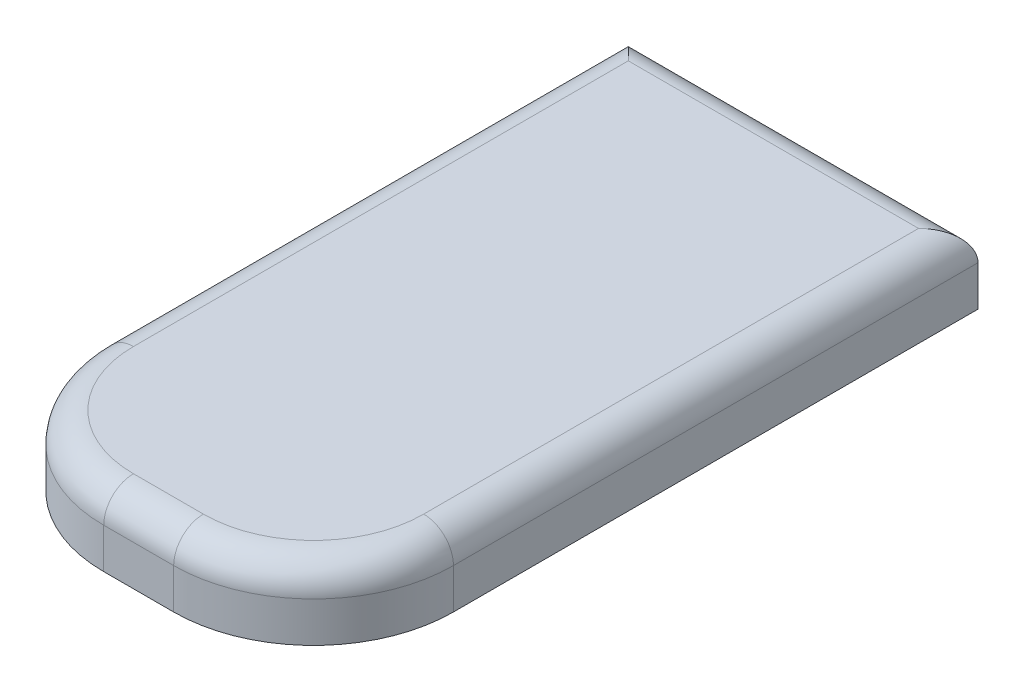
ISO-10303-21;
HEADER;
FILE_DESCRIPTION(('STEP AP214'),'2;1');
FILE_NAME('part.step','',(''),(''),'','','');
FILE_SCHEMA(('AUTOMOTIVE_DESIGN { 1 0 10303 214 1 1 1 1 }'));
ENDSEC;
DATA;
#1=APPLICATION_CONTEXT('core data for automotive mechanical design processes');
#2=APPLICATION_PROTOCOL_DEFINITION('international standard','automotive_design',2000,#1);
#3=PRODUCT_CONTEXT('',#1,'mechanical');
#4=PRODUCT('Part','Part','',(#3));
#5=PRODUCT_RELATED_PRODUCT_CATEGORY('part','',(#4));
#6=PRODUCT_DEFINITION_FORMATION('','',#4);
#7=PRODUCT_DEFINITION_CONTEXT('part definition',#1,'design');
#8=PRODUCT_DEFINITION('design','',#6,#7);
#9=PRODUCT_DEFINITION_SHAPE('','',#8);
#10=(LENGTH_UNIT() NAMED_UNIT(*) SI_UNIT(.MILLI.,.METRE.));
#11=(NAMED_UNIT(*) PLANE_ANGLE_UNIT() SI_UNIT($,.RADIAN.));
#12=(NAMED_UNIT(*) SI_UNIT($,.STERADIAN.) SOLID_ANGLE_UNIT());
#13=UNCERTAINTY_MEASURE_WITH_UNIT(LENGTH_MEASURE(1.E-05),#10,'distance_accuracy_value','');
#14=(GEOMETRIC_REPRESENTATION_CONTEXT(3) GLOBAL_UNCERTAINTY_ASSIGNED_CONTEXT((#13)) GLOBAL_UNIT_ASSIGNED_CONTEXT((#10,
#11,#12)) REPRESENTATION_CONTEXT('',''));
#15=CARTESIAN_POINT('',(0.,0.,0.));
#16=DIRECTION('',(0.,0.,1.));
#17=DIRECTION('',(1.,0.,0.));
#18=AXIS2_PLACEMENT_3D('',#15,#16,#17);
#19=CARTESIAN_POINT('',(0.,0.,965.2));
#20=DIRECTION('',(0.,1.,0.));
#21=DIRECTION('',(0.,0.,1.));
#22=AXIS2_PLACEMENT_3D('',#19,#20,#21);
#23=PLANE('',#22);
#24=CARTESIAN_POINT('',(419.1,0.,736.6));
#25=DIRECTION('',(0.,-1.,0.));
#26=DIRECTION('',(0.,0.,-1.));
#27=AXIS2_PLACEMENT_3D('',#24,#25,#26);
#28=CIRCLE('',#27,25.4);
#29=CARTESIAN_POINT('',(419.1,0.,711.2));
#30=VERTEX_POINT('',#29);
#31=EDGE_CURVE('E227',#30,#30,#28,.T.);
#32=ORIENTED_EDGE('',*,*,#31,.F.);
#33=EDGE_LOOP('',(#32));
#34=FACE_BOUND('',#33,.T.);
#35=CARTESIAN_POINT('',(88.9,0.,736.6));
#36=DIRECTION('',(0.,-1.,0.));
#37=DIRECTION('',(0.,0.,-1.));
#38=AXIS2_PLACEMENT_3D('',#35,#36,#37);
#39=CIRCLE('',#38,25.4);
#40=CARTESIAN_POINT('',(88.9,0.,711.2));
#41=VERTEX_POINT('',#40);
#42=EDGE_CURVE('E219',#41,#41,#39,.T.);
#43=ORIENTED_EDGE('',*,*,#42,.F.);
#44=EDGE_LOOP('',(#43));
#45=FACE_BOUND('',#44,.T.);
#46=DIRECTION('',(1.,0.,0.));
#47=VECTOR('',#46,1.);
#48=CARTESIAN_POINT('',(127.,0.,215.9));
#49=LINE('',#48,#47);
#50=CARTESIAN_POINT('',(101.6,0.,215.9));
#51=VERTEX_POINT('',#50);
#52=CARTESIAN_POINT('',(127.,0.,215.9));
#53=VERTEX_POINT('',#52);
#54=EDGE_CURVE('E200',#51,#53,#49,.T.);
#55=ORIENTED_EDGE('',*,*,#54,.F.);
#56=DIRECTION('',(0.,0.,-1.));
#57=VECTOR('',#56,1.);
#58=CARTESIAN_POINT('',(101.6,0.,215.9));
#59=LINE('',#58,#57);
#60=CARTESIAN_POINT('',(101.6,0.,241.3));
#61=VERTEX_POINT('',#60);
#62=EDGE_CURVE('E167',#61,#51,#59,.T.);
#63=ORIENTED_EDGE('',*,*,#62,.F.);
#64=DIRECTION('',(-1.,0.,0.));
#65=VECTOR('',#64,1.);
#66=CARTESIAN_POINT('',(127.,0.,241.3));
#67=LINE('',#66,#65);
#68=CARTESIAN_POINT('',(127.,0.,241.3));
#69=VERTEX_POINT('',#68);
#70=EDGE_CURVE('E187',#69,#61,#67,.T.);
#71=ORIENTED_EDGE('',*,*,#70,.F.);
#72=DIRECTION('',(0.,0.,1.));
#73=VECTOR('',#72,1.);
#74=CARTESIAN_POINT('',(127.,0.,215.9));
#75=LINE('',#74,#73);
#76=EDGE_CURVE('E191',#53,#69,#75,.T.);
#77=ORIENTED_EDGE('',*,*,#76,.F.);
#78=EDGE_LOOP('',(#55,#63,#71,#77));
#79=FACE_BOUND('',#78,.T.);
#80=DIRECTION('',(1.,0.,0.));
#81=VECTOR('',#80,1.);
#82=CARTESIAN_POINT('',(406.4,0.,215.9));
#83=LINE('',#82,#81);
#84=CARTESIAN_POINT('',(381.,0.,215.9));
#85=VERTEX_POINT('',#84);
#86=CARTESIAN_POINT('',(406.4,0.,215.9));
#87=VERTEX_POINT('',#86);
#88=EDGE_CURVE('E251',#85,#87,#83,.T.);
#89=ORIENTED_EDGE('',*,*,#88,.F.);
#90=DIRECTION('',(0.,0.,-1.));
#91=VECTOR('',#90,1.);
#92=CARTESIAN_POINT('',(381.,0.,215.9));
#93=LINE('',#92,#91);
#94=CARTESIAN_POINT('',(381.,0.,241.3));
#95=VERTEX_POINT('',#94);
#96=EDGE_CURVE('E210',#95,#85,#93,.T.);
#97=ORIENTED_EDGE('',*,*,#96,.F.);
#98=DIRECTION('',(-1.,0.,0.));
#99=VECTOR('',#98,1.);
#100=CARTESIAN_POINT('',(406.4,0.,241.3));
#101=LINE('',#100,#99);
#102=CARTESIAN_POINT('',(406.4,0.,241.3));
#103=VERTEX_POINT('',#102);
#104=EDGE_CURVE('E236',#103,#95,#101,.T.);
#105=ORIENTED_EDGE('',*,*,#104,.F.);
#106=DIRECTION('',(0.,0.,1.));
#107=VECTOR('',#106,1.);
#108=CARTESIAN_POINT('',(406.4,0.,215.9));
#109=LINE('',#108,#107);
#110=EDGE_CURVE('E255',#87,#103,#109,.T.);
#111=ORIENTED_EDGE('',*,*,#110,.F.);
#112=EDGE_LOOP('',(#89,#97,#105,#111));
#113=FACE_BOUND('',#112,.T.);
#114=DIRECTION('',(0.,0.,-1.));
#115=VECTOR('',#114,1.);
#116=CARTESIAN_POINT('',(508.,0.,965.2));
#117=LINE('',#116,#115);
#118=CARTESIAN_POINT('',(508.,0.,762.));
#119=VERTEX_POINT('',#118);
#120=CARTESIAN_POINT('',(508.,0.,0.));
#121=VERTEX_POINT('',#120);
#122=EDGE_CURVE('E292',#119,#121,#117,.T.);
#123=ORIENTED_EDGE('',*,*,#122,.F.);
#124=CARTESIAN_POINT('',(304.8,0.,762.));
#125=DIRECTION('',(0.,1.,0.));
#126=DIRECTION('',(0.,0.,1.));
#127=AXIS2_PLACEMENT_3D('',#124,#125,#126);
#128=CIRCLE('',#127,203.2);
#129=CARTESIAN_POINT('',(304.8,0.,965.2));
#130=VERTEX_POINT('',#129);
#131=EDGE_CURVE('E309',#119,#130,#128,.F.);
#132=ORIENTED_EDGE('',*,*,#131,.T.);
#133=DIRECTION('',(1.,0.,0.));
#134=VECTOR('',#133,1.);
#135=CARTESIAN_POINT('',(0.,0.,965.2));
#136=LINE('',#135,#134);
#137=CARTESIAN_POINT('',(203.2,0.,965.2));
#138=VERTEX_POINT('',#137);
#139=EDGE_CURVE('E275',#138,#130,#136,.T.);
#140=ORIENTED_EDGE('',*,*,#139,.F.);
#141=CARTESIAN_POINT('',(203.2,0.,762.));
#142=DIRECTION('',(0.,1.,0.));
#143=DIRECTION('',(0.,0.,1.));
#144=AXIS2_PLACEMENT_3D('',#141,#142,#143);
#145=CIRCLE('',#144,203.2);
#146=CARTESIAN_POINT('',(0.,0.,762.));
#147=VERTEX_POINT('',#146);
#148=EDGE_CURVE('E299',#138,#147,#145,.F.);
#149=ORIENTED_EDGE('',*,*,#148,.T.);
#150=DIRECTION('',(0.,0.,-1.));
#151=VECTOR('',#150,1.);
#152=CARTESIAN_POINT('',(0.,0.,965.2));
#153=LINE('',#152,#151);
#154=CARTESIAN_POINT('',(0.,0.,0.));
#155=VERTEX_POINT('',#154);
#156=EDGE_CURVE('E279',#147,#155,#153,.T.);
#157=ORIENTED_EDGE('',*,*,#156,.T.);
#158=DIRECTION('',(1.,0.,0.));
#159=VECTOR('',#158,1.);
#160=CARTESIAN_POINT('',(0.,0.,0.));
#161=LINE('',#160,#159);
#162=EDGE_CURVE('E265',#155,#121,#161,.T.);
#163=ORIENTED_EDGE('',*,*,#162,.T.);
#164=EDGE_LOOP('',(#123,#132,#140,#149,#157,#163));
#165=FACE_BOUND('',#164,.T.);
#166=ADVANCED_FACE('F39',(#34,#45,#79,#113,#165),#23,.F.);
#167=CARTESIAN_POINT('',(508.,101.6,965.2));
#168=DIRECTION('',(1.,0.,0.));
#169=DIRECTION('',(0.,0.,-1.));
#170=AXIS2_PLACEMENT_3D('',#167,#168,#169);
#171=PLANE('',#170);
#172=DIRECTION('',(0.,-1.,0.));
#173=VECTOR('',#172,1.);
#174=CARTESIAN_POINT('',(508.,101.6,0.));
#175=LINE('',#174,#173);
#176=CARTESIAN_POINT('',(508.,58.42,0.));
#177=VERTEX_POINT('',#176);
#178=EDGE_CURVE('E284',#177,#121,#175,.T.);
#179=ORIENTED_EDGE('',*,*,#178,.F.);
#180=DIRECTION('',(0.,0.,-1.));
#181=VECTOR('',#180,1.);
#182=CARTESIAN_POINT('',(508.,58.42,965.2));
#183=LINE('',#182,#181);
#184=CARTESIAN_POINT('',(508.,58.42,762.));
#185=VERTEX_POINT('',#184);
#186=EDGE_CURVE('E334',#177,#185,#183,.F.);
#187=ORIENTED_EDGE('',*,*,#186,.T.);
#188=DIRECTION('',(0.,-1.,0.));
#189=VECTOR('',#188,1.);
#190=CARTESIAN_POINT('',(508.,0.,762.));
#191=LINE('',#190,#189);
#192=EDGE_CURVE('E306',#185,#119,#191,.T.);
#193=ORIENTED_EDGE('',*,*,#192,.T.);
#194=ORIENTED_EDGE('',*,*,#122,.T.);
#195=EDGE_LOOP('',(#179,#187,#193,#194));
#196=FACE_BOUND('',#195,.T.);
#197=ADVANCED_FACE('F398',(#196),#171,.T.);
#198=CARTESIAN_POINT('',(0.,101.6,965.2));
#199=DIRECTION('',(0.,1.,0.));
#200=DIRECTION('',(-1.,0.,0.));
#201=AXIS2_PLACEMENT_3D('',#198,#199,#200);
#202=PLANE('',#201);
#203=CARTESIAN_POINT('',(304.8,101.6,762.));
#204=DIRECTION('',(0.,1.,0.));
#205=DIRECTION('',(-1.,0.,0.));
#206=AXIS2_PLACEMENT_3D('',#203,#204,#205);
#207=CIRCLE('',#206,160.02);
#208=CARTESIAN_POINT('',(304.8,101.6,922.02));
#209=VERTEX_POINT('',#208);
#210=CARTESIAN_POINT('',(464.82,101.6,762.));
#211=VERTEX_POINT('',#210);
#212=EDGE_CURVE('E315',#209,#211,#207,.T.);
#213=ORIENTED_EDGE('',*,*,#212,.T.);
#214=DIRECTION('',(0.,0.,-1.));
#215=VECTOR('',#214,1.);
#216=CARTESIAN_POINT('',(464.82,101.6,965.2));
#217=LINE('',#216,#215);
#218=CARTESIAN_POINT('',(464.82,101.6,43.18));
#219=VERTEX_POINT('',#218);
#220=EDGE_CURVE('E330',#211,#219,#217,.T.);
#221=ORIENTED_EDGE('',*,*,#220,.T.);
#222=DIRECTION('',(1.,0.,0.));
#223=VECTOR('',#222,1.);
#224=CARTESIAN_POINT('',(0.,101.6,43.18));
#225=LINE('',#224,#223);
#226=CARTESIAN_POINT('',(43.18,101.6,43.18));
#227=VERTEX_POINT('',#226);
#228=EDGE_CURVE('E327',#219,#227,#225,.F.);
#229=ORIENTED_EDGE('',*,*,#228,.T.);
#230=DIRECTION('',(0.,0.,-1.));
#231=VECTOR('',#230,1.);
#232=CARTESIAN_POINT('',(43.18,101.6,762.));
#233=LINE('',#232,#231);
#234=CARTESIAN_POINT('',(43.18,101.6,762.));
#235=VERTEX_POINT('',#234);
#236=EDGE_CURVE('E324',#227,#235,#233,.F.);
#237=ORIENTED_EDGE('',*,*,#236,.T.);
#238=CARTESIAN_POINT('',(203.2,101.6,762.));
#239=DIRECTION('',(0.,1.,0.));
#240=DIRECTION('',(-1.,0.,0.));
#241=AXIS2_PLACEMENT_3D('',#238,#239,#240);
#242=CIRCLE('',#241,160.02);
#243=CARTESIAN_POINT('',(203.2,101.6,922.02));
#244=VERTEX_POINT('',#243);
#245=EDGE_CURVE('E321',#235,#244,#242,.T.);
#246=ORIENTED_EDGE('',*,*,#245,.T.);
#247=DIRECTION('',(1.,0.,0.));
#248=VECTOR('',#247,1.);
#249=CARTESIAN_POINT('',(304.8,101.6,922.02));
#250=LINE('',#249,#248);
#251=EDGE_CURVE('E318',#244,#209,#250,.T.);
#252=ORIENTED_EDGE('',*,*,#251,.T.);
#253=EDGE_LOOP('',(#213,#221,#229,#237,#246,#252));
#254=FACE_BOUND('',#253,.T.);
#255=ADVANCED_FACE('F417',(#254),#202,.T.);
#256=CARTESIAN_POINT('',(0.,101.6,965.2));
#257=DIRECTION('',(1.,0.,0.));
#258=DIRECTION('',(0.,0.,-1.));
#259=AXIS2_PLACEMENT_3D('',#256,#257,#258);
#260=PLANE('',#259);
#261=DIRECTION('',(0.,-1.,0.));
#262=VECTOR('',#261,1.);
#263=CARTESIAN_POINT('',(0.,101.6,762.));
#264=LINE('',#263,#262);
#265=CARTESIAN_POINT('',(0.,58.42,762.));
#266=VERTEX_POINT('',#265);
#267=EDGE_CURVE('E302',#147,#266,#264,.F.);
#268=ORIENTED_EDGE('',*,*,#267,.T.);
#269=DIRECTION('',(0.,0.,-1.));
#270=VECTOR('',#269,1.);
#271=CARTESIAN_POINT('',(0.,58.42,0.));
#272=LINE('',#271,#270);
#273=CARTESIAN_POINT('',(0.,58.42,0.));
#274=VERTEX_POINT('',#273);
#275=EDGE_CURVE('E341',#266,#274,#272,.T.);
#276=ORIENTED_EDGE('',*,*,#275,.T.);
#277=DIRECTION('',(0.,-1.,0.));
#278=VECTOR('',#277,1.);
#279=CARTESIAN_POINT('',(0.,101.6,0.));
#280=LINE('',#279,#278);
#281=EDGE_CURVE('E280',#274,#155,#280,.T.);
#282=ORIENTED_EDGE('',*,*,#281,.T.);
#283=ORIENTED_EDGE('',*,*,#156,.F.);
#284=EDGE_LOOP('',(#268,#276,#282,#283));
#285=FACE_BOUND('',#284,.T.);
#286=ADVANCED_FACE('F385',(#285),#260,.F.);
#287=CARTESIAN_POINT('',(0.,0.,965.2));
#288=DIRECTION('',(0.,0.,-1.));
#289=DIRECTION('',(-1.,0.,0.));
#290=AXIS2_PLACEMENT_3D('',#287,#288,#289);
#291=PLANE('',#290);
#292=DIRECTION('',(0.,-1.,0.));
#293=VECTOR('',#292,1.);
#294=CARTESIAN_POINT('',(304.8,101.6,965.2));
#295=LINE('',#294,#293);
#296=CARTESIAN_POINT('',(304.8,58.42,965.2));
#297=VERTEX_POINT('',#296);
#298=EDGE_CURVE('E312',#130,#297,#295,.F.);
#299=ORIENTED_EDGE('',*,*,#298,.T.);
#300=DIRECTION('',(1.,0.,0.));
#301=VECTOR('',#300,1.);
#302=CARTESIAN_POINT('',(203.2,58.42,965.2));
#303=LINE('',#302,#301);
#304=CARTESIAN_POINT('',(203.2,58.42,965.2));
#305=VERTEX_POINT('',#304);
#306=EDGE_CURVE('E49',#297,#305,#303,.F.);
#307=ORIENTED_EDGE('',*,*,#306,.T.);
#308=DIRECTION('',(0.,-1.,0.));
#309=VECTOR('',#308,1.);
#310=CARTESIAN_POINT('',(203.2,0.,965.2));
#311=LINE('',#310,#309);
#312=EDGE_CURVE('E296',#305,#138,#311,.T.);
#313=ORIENTED_EDGE('',*,*,#312,.T.);
#314=ORIENTED_EDGE('',*,*,#139,.T.);
#315=EDGE_LOOP('',(#299,#307,#313,#314));
#316=FACE_BOUND('',#315,.T.);
#317=ADVANCED_FACE('F400',(#316),#291,.F.);
#318=CARTESIAN_POINT('',(0.,0.,0.));
#319=DIRECTION('',(0.,0.,-1.));
#320=DIRECTION('',(-1.,0.,0.));
#321=AXIS2_PLACEMENT_3D('',#318,#319,#320);
#322=PLANE('',#321);
#323=ORIENTED_EDGE('',*,*,#281,.F.);
#324=DIRECTION('',(1.,0.,0.));
#325=VECTOR('',#324,1.);
#326=CARTESIAN_POINT('',(0.,58.42,0.));
#327=LINE('',#326,#325);
#328=EDGE_CURVE('E338',#274,#177,#327,.T.);
#329=ORIENTED_EDGE('',*,*,#328,.T.);
#330=ORIENTED_EDGE('',*,*,#178,.T.);
#331=ORIENTED_EDGE('',*,*,#162,.F.);
#332=EDGE_LOOP('',(#323,#329,#330,#331));
#333=FACE_BOUND('',#332,.T.);
#334=ADVANCED_FACE('F392',(#333),#322,.T.);
#335=CARTESIAN_POINT('',(381.,50.8,215.9));
#336=DIRECTION('',(-1.,0.,0.));
#337=DIRECTION('',(0.,0.,1.));
#338=AXIS2_PLACEMENT_3D('',#335,#336,#337);
#339=PLANE('',#338);
#340=ORIENTED_EDGE('',*,*,#96,.T.);
#341=DIRECTION('',(0.,-1.,0.));
#342=VECTOR('',#341,1.);
#343=CARTESIAN_POINT('',(381.,50.8,215.9));
#344=LINE('',#343,#342);
#345=CARTESIAN_POINT('',(381.,50.8,215.9));
#346=VERTEX_POINT('',#345);
#347=EDGE_CURVE('E248',#346,#85,#344,.T.);
#348=ORIENTED_EDGE('',*,*,#347,.F.);
#349=DIRECTION('',(0.,0.,-1.));
#350=VECTOR('',#349,1.);
#351=CARTESIAN_POINT('',(381.,50.8,215.9));
#352=LINE('',#351,#350);
#353=CARTESIAN_POINT('',(381.,50.8,241.3));
#354=VERTEX_POINT('',#353);
#355=EDGE_CURVE('E231',#354,#346,#352,.T.);
#356=ORIENTED_EDGE('',*,*,#355,.F.);
#357=DIRECTION('',(0.,-1.,0.));
#358=VECTOR('',#357,1.);
#359=CARTESIAN_POINT('',(381.,50.8,241.3));
#360=LINE('',#359,#358);
#361=EDGE_CURVE('E262',#354,#95,#360,.T.);
#362=ORIENTED_EDGE('',*,*,#361,.T.);
#363=EDGE_LOOP('',(#340,#348,#356,#362));
#364=FACE_BOUND('',#363,.T.);
#365=ADVANCED_FACE('F429',(#364),#339,.F.);
#366=CARTESIAN_POINT('',(406.4,50.8,241.3));
#367=DIRECTION('',(0.,0.,1.));
#368=DIRECTION('',(1.,0.,0.));
#369=AXIS2_PLACEMENT_3D('',#366,#367,#368);
#370=PLANE('',#369);
#371=ORIENTED_EDGE('',*,*,#104,.T.);
#372=ORIENTED_EDGE('',*,*,#361,.F.);
#373=DIRECTION('',(-1.,0.,0.));
#374=VECTOR('',#373,1.);
#375=CARTESIAN_POINT('',(406.4,50.8,241.3));
#376=LINE('',#375,#374);
#377=CARTESIAN_POINT('',(406.4,50.8,241.3));
#378=VERTEX_POINT('',#377);
#379=EDGE_CURVE('E244',#378,#354,#376,.T.);
#380=ORIENTED_EDGE('',*,*,#379,.F.);
#381=DIRECTION('',(0.,-1.,0.));
#382=VECTOR('',#381,1.);
#383=CARTESIAN_POINT('',(406.4,50.8,241.3));
#384=LINE('',#383,#382);
#385=EDGE_CURVE('E266',#378,#103,#384,.T.);
#386=ORIENTED_EDGE('',*,*,#385,.T.);
#387=EDGE_LOOP('',(#371,#372,#380,#386));
#388=FACE_BOUND('',#387,.T.);
#389=ADVANCED_FACE('F434',(#388),#370,.F.);
#390=CARTESIAN_POINT('',(406.4,50.8,215.9));
#391=DIRECTION('',(1.,0.,0.));
#392=DIRECTION('',(0.,0.,-1.));
#393=AXIS2_PLACEMENT_3D('',#390,#391,#392);
#394=PLANE('',#393);
#395=ORIENTED_EDGE('',*,*,#110,.T.);
#396=ORIENTED_EDGE('',*,*,#385,.F.);
#397=DIRECTION('',(0.,0.,1.));
#398=VECTOR('',#397,1.);
#399=CARTESIAN_POINT('',(406.4,50.8,215.9));
#400=LINE('',#399,#398);
#401=CARTESIAN_POINT('',(406.4,50.8,215.9));
#402=VERTEX_POINT('',#401);
#403=EDGE_CURVE('E240',#402,#378,#400,.T.);
#404=ORIENTED_EDGE('',*,*,#403,.F.);
#405=DIRECTION('',(0.,-1.,0.));
#406=VECTOR('',#405,1.);
#407=CARTESIAN_POINT('',(406.4,50.8,215.9));
#408=LINE('',#407,#406);
#409=EDGE_CURVE('E269',#402,#87,#408,.T.);
#410=ORIENTED_EDGE('',*,*,#409,.T.);
#411=EDGE_LOOP('',(#395,#396,#404,#410));
#412=FACE_BOUND('',#411,.T.);
#413=ADVANCED_FACE('F440',(#412),#394,.F.);
#414=CARTESIAN_POINT('',(406.4,50.8,215.9));
#415=DIRECTION('',(0.,0.,-1.));
#416=DIRECTION('',(-1.,0.,0.));
#417=AXIS2_PLACEMENT_3D('',#414,#415,#416);
#418=PLANE('',#417);
#419=ORIENTED_EDGE('',*,*,#88,.T.);
#420=ORIENTED_EDGE('',*,*,#409,.F.);
#421=DIRECTION('',(1.,0.,0.));
#422=VECTOR('',#421,1.);
#423=CARTESIAN_POINT('',(406.4,50.8,215.9));
#424=LINE('',#423,#422);
#425=EDGE_CURVE('E235',#346,#402,#424,.T.);
#426=ORIENTED_EDGE('',*,*,#425,.F.);
#427=ORIENTED_EDGE('',*,*,#347,.T.);
#428=EDGE_LOOP('',(#419,#420,#426,#427));
#429=FACE_BOUND('',#428,.T.);
#430=ADVANCED_FACE('F436',(#429),#418,.F.);
#431=CARTESIAN_POINT('',(0.,50.8,0.));
#432=DIRECTION('',(0.,-1.,0.));
#433=DIRECTION('',(0.,0.,-1.));
#434=AXIS2_PLACEMENT_3D('',#431,#432,#433);
#435=PLANE('',#434);
#436=ORIENTED_EDGE('',*,*,#355,.T.);
#437=ORIENTED_EDGE('',*,*,#425,.T.);
#438=ORIENTED_EDGE('',*,*,#403,.T.);
#439=ORIENTED_EDGE('',*,*,#379,.T.);
#440=EDGE_LOOP('',(#436,#437,#438,#439));
#441=FACE_BOUND('',#440,.T.);
#442=ADVANCED_FACE('F439',(#441),#435,.T.);
#443=CARTESIAN_POINT('',(101.6,50.8,215.9));
#444=DIRECTION('',(-1.,0.,0.));
#445=DIRECTION('',(0.,0.,1.));
#446=AXIS2_PLACEMENT_3D('',#443,#444,#445);
#447=PLANE('',#446);
#448=ORIENTED_EDGE('',*,*,#62,.T.);
#449=DIRECTION('',(0.,-1.,0.));
#450=VECTOR('',#449,1.);
#451=CARTESIAN_POINT('',(101.6,50.8,215.9));
#452=LINE('',#451,#450);
#453=CARTESIAN_POINT('',(101.6,50.8,215.9));
#454=VERTEX_POINT('',#453);
#455=EDGE_CURVE('E160',#454,#51,#452,.T.);
#456=ORIENTED_EDGE('',*,*,#455,.F.);
#457=DIRECTION('',(0.,0.,-1.));
#458=VECTOR('',#457,1.);
#459=CARTESIAN_POINT('',(101.6,50.8,215.9));
#460=LINE('',#459,#458);
#461=CARTESIAN_POINT('',(101.6,50.8,241.3));
#462=VERTEX_POINT('',#461);
#463=EDGE_CURVE('E164',#462,#454,#460,.T.);
#464=ORIENTED_EDGE('',*,*,#463,.F.);
#465=DIRECTION('',(0.,-1.,0.));
#466=VECTOR('',#465,1.);
#467=CARTESIAN_POINT('',(101.6,50.8,241.3));
#468=LINE('',#467,#466);
#469=EDGE_CURVE('E207',#462,#61,#468,.T.);
#470=ORIENTED_EDGE('',*,*,#469,.T.);
#471=EDGE_LOOP('',(#448,#456,#464,#470));
#472=FACE_BOUND('',#471,.T.);
#473=ADVANCED_FACE('F162',(#472),#447,.F.);
#474=CARTESIAN_POINT('',(127.,50.8,241.3));
#475=DIRECTION('',(0.,0.,1.));
#476=DIRECTION('',(1.,0.,0.));
#477=AXIS2_PLACEMENT_3D('',#474,#475,#476);
#478=PLANE('',#477);
#479=ORIENTED_EDGE('',*,*,#70,.T.);
#480=ORIENTED_EDGE('',*,*,#469,.F.);
#481=DIRECTION('',(-1.,0.,0.));
#482=VECTOR('',#481,1.);
#483=CARTESIAN_POINT('',(127.,50.8,241.3));
#484=LINE('',#483,#482);
#485=CARTESIAN_POINT('',(127.,50.8,241.3));
#486=VERTEX_POINT('',#485);
#487=EDGE_CURVE('E173',#486,#462,#484,.T.);
#488=ORIENTED_EDGE('',*,*,#487,.F.);
#489=DIRECTION('',(0.,-1.,0.));
#490=VECTOR('',#489,1.);
#491=CARTESIAN_POINT('',(127.,50.8,241.3));
#492=LINE('',#491,#490);
#493=EDGE_CURVE('E211',#486,#69,#492,.T.);
#494=ORIENTED_EDGE('',*,*,#493,.T.);
#495=EDGE_LOOP('',(#479,#480,#488,#494));
#496=FACE_BOUND('',#495,.T.);
#497=ADVANCED_FACE('F468',(#496),#478,.F.);
#498=CARTESIAN_POINT('',(127.,50.8,215.9));
#499=DIRECTION('',(1.,0.,0.));
#500=DIRECTION('',(0.,0.,-1.));
#501=AXIS2_PLACEMENT_3D('',#498,#499,#500);
#502=PLANE('',#501);
#503=ORIENTED_EDGE('',*,*,#76,.T.);
#504=ORIENTED_EDGE('',*,*,#493,.F.);
#505=DIRECTION('',(0.,0.,1.));
#506=VECTOR('',#505,1.);
#507=CARTESIAN_POINT('',(127.,50.8,215.9));
#508=LINE('',#507,#506);
#509=CARTESIAN_POINT('',(127.,50.8,215.9));
#510=VERTEX_POINT('',#509);
#511=EDGE_CURVE('E182',#510,#486,#508,.T.);
#512=ORIENTED_EDGE('',*,*,#511,.F.);
#513=DIRECTION('',(0.,-1.,0.));
#514=VECTOR('',#513,1.);
#515=CARTESIAN_POINT('',(127.,50.8,215.9));
#516=LINE('',#515,#514);
#517=EDGE_CURVE('E172',#510,#53,#516,.T.);
#518=ORIENTED_EDGE('',*,*,#517,.T.);
#519=EDGE_LOOP('',(#503,#504,#512,#518));
#520=FACE_BOUND('',#519,.T.);
#521=ADVANCED_FACE('F471',(#520),#502,.F.);
#522=CARTESIAN_POINT('',(127.,50.8,215.9));
#523=DIRECTION('',(0.,0.,-1.));
#524=DIRECTION('',(-1.,0.,0.));
#525=AXIS2_PLACEMENT_3D('',#522,#523,#524);
#526=PLANE('',#525);
#527=ORIENTED_EDGE('',*,*,#54,.T.);
#528=ORIENTED_EDGE('',*,*,#517,.F.);
#529=DIRECTION('',(1.,0.,0.));
#530=VECTOR('',#529,1.);
#531=CARTESIAN_POINT('',(127.,50.8,215.9));
#532=LINE('',#531,#530);
#533=EDGE_CURVE('E176',#454,#510,#532,.T.);
#534=ORIENTED_EDGE('',*,*,#533,.F.);
#535=ORIENTED_EDGE('',*,*,#455,.T.);
#536=EDGE_LOOP('',(#527,#528,#534,#535));
#537=FACE_BOUND('',#536,.T.);
#538=ADVANCED_FACE('F177',(#537),#526,.F.);
#539=CARTESIAN_POINT('',(0.,50.8,0.));
#540=DIRECTION('',(0.,-1.,0.));
#541=DIRECTION('',(0.,0.,-1.));
#542=AXIS2_PLACEMENT_3D('',#539,#540,#541);
#543=PLANE('',#542);
#544=ORIENTED_EDGE('',*,*,#463,.T.);
#545=ORIENTED_EDGE('',*,*,#533,.T.);
#546=ORIENTED_EDGE('',*,*,#511,.T.);
#547=ORIENTED_EDGE('',*,*,#487,.T.);
#548=EDGE_LOOP('',(#544,#545,#546,#547));
#549=FACE_BOUND('',#548,.T.);
#550=ADVANCED_FACE('F184',(#549),#543,.T.);
#551=CARTESIAN_POINT('',(88.9,50.8,736.6));
#552=DIRECTION('',(0.,-1.,0.));
#553=DIRECTION('',(0.,0.,-1.));
#554=AXIS2_PLACEMENT_3D('',#551,#552,#553);
#555=CYLINDRICAL_SURFACE('',#554,25.4);
#556=CARTESIAN_POINT('',(88.9,50.8,736.6));
#557=DIRECTION('',(0.,-1.,0.));
#558=DIRECTION('',(0.,0.,-1.));
#559=AXIS2_PLACEMENT_3D('',#556,#557,#558);
#560=CIRCLE('',#559,25.4);
#561=CARTESIAN_POINT('',(88.9,50.8,711.2));
#562=VERTEX_POINT('',#561);
#563=EDGE_CURVE('E201',#562,#562,#560,.T.);
#564=ORIENTED_EDGE('',*,*,#563,.F.);
#565=EDGE_LOOP('',(#564));
#566=FACE_BOUND('',#565,.T.);
#567=ORIENTED_EDGE('',*,*,#42,.T.);
#568=EDGE_LOOP('',(#567));
#569=FACE_BOUND('',#568,.T.);
#570=ADVANCED_FACE('F459',(#566,#569),#555,.F.);
#571=CARTESIAN_POINT('',(88.9,50.8,736.6));
#572=DIRECTION('',(0.,-1.,0.));
#573=DIRECTION('',(0.,0.,-1.));
#574=AXIS2_PLACEMENT_3D('',#571,#572,#573);
#575=PLANE('',#574);
#576=ORIENTED_EDGE('',*,*,#563,.T.);
#577=EDGE_LOOP('',(#576));
#578=FACE_BOUND('',#577,.T.);
#579=ADVANCED_FACE('F454',(#578),#575,.T.);
#580=CARTESIAN_POINT('',(419.1,50.8,736.6));
#581=DIRECTION('',(0.,-1.,0.));
#582=DIRECTION('',(0.,0.,-1.));
#583=AXIS2_PLACEMENT_3D('',#580,#581,#582);
#584=CYLINDRICAL_SURFACE('',#583,25.4);
#585=CARTESIAN_POINT('',(419.1,50.8,736.6));
#586=DIRECTION('',(0.,-1.,0.));
#587=DIRECTION('',(0.,0.,-1.));
#588=AXIS2_PLACEMENT_3D('',#585,#586,#587);
#589=CIRCLE('',#588,25.4);
#590=CARTESIAN_POINT('',(419.1,50.8,711.2));
#591=VERTEX_POINT('',#590);
#592=EDGE_CURVE('E223',#591,#591,#589,.T.);
#593=ORIENTED_EDGE('',*,*,#592,.F.);
#594=EDGE_LOOP('',(#593));
#595=FACE_BOUND('',#594,.T.);
#596=ORIENTED_EDGE('',*,*,#31,.T.);
#597=EDGE_LOOP('',(#596));
#598=FACE_BOUND('',#597,.T.);
#599=ADVANCED_FACE('F451',(#595,#598),#584,.F.);
#600=CARTESIAN_POINT('',(419.1,50.8,736.6));
#601=DIRECTION('',(0.,-1.,0.));
#602=DIRECTION('',(0.,0.,-1.));
#603=AXIS2_PLACEMENT_3D('',#600,#601,#602);
#604=PLANE('',#603);
#605=ORIENTED_EDGE('',*,*,#592,.T.);
#606=EDGE_LOOP('',(#605));
#607=FACE_BOUND('',#606,.T.);
#608=ADVANCED_FACE('F408',(#607),#604,.T.);
#609=CARTESIAN_POINT('',(203.2,0.,762.));
#610=DIRECTION('',(0.,-1.,0.));
#611=DIRECTION('',(0.,0.,-1.));
#612=AXIS2_PLACEMENT_3D('',#609,#610,#611);
#613=CYLINDRICAL_SURFACE('',#612,203.2);
#614=ORIENTED_EDGE('',*,*,#312,.F.);
#615=CARTESIAN_POINT('',(203.2,58.42,762.));
#616=DIRECTION('',(0.,1.,0.));
#617=DIRECTION('',(-1.,0.,0.));
#618=AXIS2_PLACEMENT_3D('',#615,#616,#617);
#619=CIRCLE('',#618,203.2);
#620=EDGE_CURVE('E344',#305,#266,#619,.F.);
#621=ORIENTED_EDGE('',*,*,#620,.T.);
#622=ORIENTED_EDGE('',*,*,#267,.F.);
#623=ORIENTED_EDGE('',*,*,#148,.F.);
#624=EDGE_LOOP('',(#614,#621,#622,#623));
#625=FACE_BOUND('',#624,.T.);
#626=ADVANCED_FACE('F381',(#625),#613,.T.);
#627=CARTESIAN_POINT('',(304.8,101.6,762.));
#628=DIRECTION('',(0.,1.,0.));
#629=DIRECTION('',(0.,0.,1.));
#630=AXIS2_PLACEMENT_3D('',#627,#628,#629);
#631=CYLINDRICAL_SURFACE('',#630,203.2);
#632=ORIENTED_EDGE('',*,*,#192,.F.);
#633=CARTESIAN_POINT('',(304.8,58.42,762.));
#634=DIRECTION('',(0.,1.,0.));
#635=DIRECTION('',(-1.,0.,0.));
#636=AXIS2_PLACEMENT_3D('',#633,#634,#635);
#637=CIRCLE('',#636,203.2);
#638=EDGE_CURVE('E11',#185,#297,#637,.F.);
#639=ORIENTED_EDGE('',*,*,#638,.T.);
#640=ORIENTED_EDGE('',*,*,#298,.F.);
#641=ORIENTED_EDGE('',*,*,#131,.F.);
#642=EDGE_LOOP('',(#632,#639,#640,#641));
#643=FACE_BOUND('',#642,.T.);
#644=ADVANCED_FACE('F401',(#643),#631,.T.);
#645=CARTESIAN_POINT('',(203.2,58.42,762.));
#646=DIRECTION('',(0.,1.,0.));
#647=DIRECTION('',(-1.,0.,0.));
#648=AXIS2_PLACEMENT_3D('',#645,#646,#647);
#649=TOROIDAL_SURFACE('',#648,160.02,43.18);
#650=CARTESIAN_POINT('',(43.18,58.42,762.));
#651=DIRECTION('',(0.,0.,-1.));
#652=DIRECTION('',(-1.,0.,0.));
#653=AXIS2_PLACEMENT_3D('',#650,#651,#652);
#654=CIRCLE('',#653,43.18);
#655=EDGE_CURVE('E362',#266,#235,#654,.T.);
#656=ORIENTED_EDGE('',*,*,#655,.F.);
#657=ORIENTED_EDGE('',*,*,#620,.F.);
#658=CARTESIAN_POINT('',(203.2,58.42,922.02));
#659=DIRECTION('',(1.,0.,0.));
#660=DIRECTION('',(0.,0.,-1.));
#661=AXIS2_PLACEMENT_3D('',#658,#659,#660);
#662=CIRCLE('',#661,43.18);
#663=EDGE_CURVE('E43',#244,#305,#662,.T.);
#664=ORIENTED_EDGE('',*,*,#663,.F.);
#665=ORIENTED_EDGE('',*,*,#245,.F.);
#666=EDGE_LOOP('',(#656,#657,#664,#665));
#667=FACE_BOUND('',#666,.T.);
#668=ADVANCED_FACE('F41',(#667),#649,.T.);
#669=CARTESIAN_POINT('',(0.,58.42,922.02));
#670=DIRECTION('',(-1.,0.,0.));
#671=DIRECTION('',(0.,-1.,0.));
#672=AXIS2_PLACEMENT_3D('',#669,#670,#671);
#673=CYLINDRICAL_SURFACE('',#672,43.18);
#674=ORIENTED_EDGE('',*,*,#663,.T.);
#675=ORIENTED_EDGE('',*,*,#306,.F.);
#676=CARTESIAN_POINT('',(304.8,58.42,922.02));
#677=DIRECTION('',(1.,0.,0.));
#678=DIRECTION('',(0.,0.,-1.));
#679=AXIS2_PLACEMENT_3D('',#676,#677,#678);
#680=CIRCLE('',#679,43.18);
#681=EDGE_CURVE('E359',#209,#297,#680,.T.);
#682=ORIENTED_EDGE('',*,*,#681,.F.);
#683=ORIENTED_EDGE('',*,*,#251,.F.);
#684=EDGE_LOOP('',(#674,#675,#682,#683));
#685=FACE_BOUND('',#684,.T.);
#686=ADVANCED_FACE('F374',(#685),#673,.T.);
#687=CARTESIAN_POINT('',(43.18,58.42,965.2));
#688=DIRECTION('',(0.,0.,1.));
#689=DIRECTION('',(1.,0.,0.));
#690=AXIS2_PLACEMENT_3D('',#687,#688,#689);
#691=CYLINDRICAL_SURFACE('',#690,43.18);
#692=ORIENTED_EDGE('',*,*,#655,.T.);
#693=ORIENTED_EDGE('',*,*,#236,.F.);
#694=CARTESIAN_POINT('',(43.18,58.42,43.18));
#695=DIRECTION('',(-0.707106781186547,0.,0.707106781186547));
#696=DIRECTION('',(0.707106781186547,0.,0.707106781186547));
#697=AXIS2_PLACEMENT_3D('',#694,#695,#696);
#698=ELLIPSE('',#697,61.0657416232702,43.18);
#699=EDGE_CURVE('E355',#274,#227,#698,.F.);
#700=ORIENTED_EDGE('',*,*,#699,.F.);
#701=ORIENTED_EDGE('',*,*,#275,.F.);
#702=EDGE_LOOP('',(#692,#693,#700,#701));
#703=FACE_BOUND('',#702,.T.);
#704=ADVANCED_FACE('F526',(#703),#691,.T.);
#705=CARTESIAN_POINT('',(304.8,58.42,762.));
#706=DIRECTION('',(0.,1.,0.));
#707=DIRECTION('',(-1.,0.,0.));
#708=AXIS2_PLACEMENT_3D('',#705,#706,#707);
#709=TOROIDAL_SURFACE('',#708,160.02,43.18);
#710=ORIENTED_EDGE('',*,*,#681,.T.);
#711=ORIENTED_EDGE('',*,*,#638,.F.);
#712=CARTESIAN_POINT('',(464.82,58.42,762.));
#713=DIRECTION('',(0.,0.,-1.));
#714=DIRECTION('',(-1.,0.,0.));
#715=AXIS2_PLACEMENT_3D('',#712,#713,#714);
#716=CIRCLE('',#715,43.18);
#717=EDGE_CURVE('E352',#211,#185,#716,.T.);
#718=ORIENTED_EDGE('',*,*,#717,.F.);
#719=ORIENTED_EDGE('',*,*,#212,.F.);
#720=EDGE_LOOP('',(#710,#711,#718,#719));
#721=FACE_BOUND('',#720,.T.);
#722=ADVANCED_FACE('F534',(#721),#709,.T.);
#723=CARTESIAN_POINT('',(0.,58.42,43.18));
#724=DIRECTION('',(1.,0.,0.));
#725=DIRECTION('',(0.,1.,0.));
#726=AXIS2_PLACEMENT_3D('',#723,#724,#725);
#727=CYLINDRICAL_SURFACE('',#726,43.18);
#728=ORIENTED_EDGE('',*,*,#699,.T.);
#729=ORIENTED_EDGE('',*,*,#228,.F.);
#730=CARTESIAN_POINT('',(464.82,58.42,43.18));
#731=DIRECTION('',(0.707106781186547,0.,0.707106781186547));
#732=DIRECTION('',(0.707106781186547,0.,-0.707106781186547));
#733=AXIS2_PLACEMENT_3D('',#730,#731,#732);
#734=ELLIPSE('',#733,61.0657416232702,43.18);
#735=EDGE_CURVE('E349',#177,#219,#734,.T.);
#736=ORIENTED_EDGE('',*,*,#735,.F.);
#737=ORIENTED_EDGE('',*,*,#328,.F.);
#738=EDGE_LOOP('',(#728,#729,#736,#737));
#739=FACE_BOUND('',#738,.T.);
#740=ADVANCED_FACE('F543',(#739),#727,.T.);
#741=CARTESIAN_POINT('',(464.82,58.42,965.2));
#742=DIRECTION('',(0.,0.,-1.));
#743=DIRECTION('',(-1.,0.,0.));
#744=AXIS2_PLACEMENT_3D('',#741,#742,#743);
#745=CYLINDRICAL_SURFACE('',#744,43.18);
#746=ORIENTED_EDGE('',*,*,#717,.T.);
#747=ORIENTED_EDGE('',*,*,#186,.F.);
#748=ORIENTED_EDGE('',*,*,#735,.T.);
#749=ORIENTED_EDGE('',*,*,#220,.F.);
#750=EDGE_LOOP('',(#746,#747,#748,#749));
#751=FACE_BOUND('',#750,.T.);
#752=ADVANCED_FACE('F553',(#751),#745,.T.);
#753=CLOSED_SHELL('',(#166,#197,#255,#286,#317,#334,#365,#389,#413,#430,#442,#473,#497,#521,
#538,#550,#570,#579,#599,#608,#626,#644,#668,#686,#704,#722,#740,#752));
#754=MANIFOLD_SOLID_BREP('B2',#753);
#755=ADVANCED_BREP_SHAPE_REPRESENTATION('',(#18,#754),#14);
#756=SHAPE_DEFINITION_REPRESENTATION(#9,#755);
ENDSEC;
END-ISO-10303-21;
